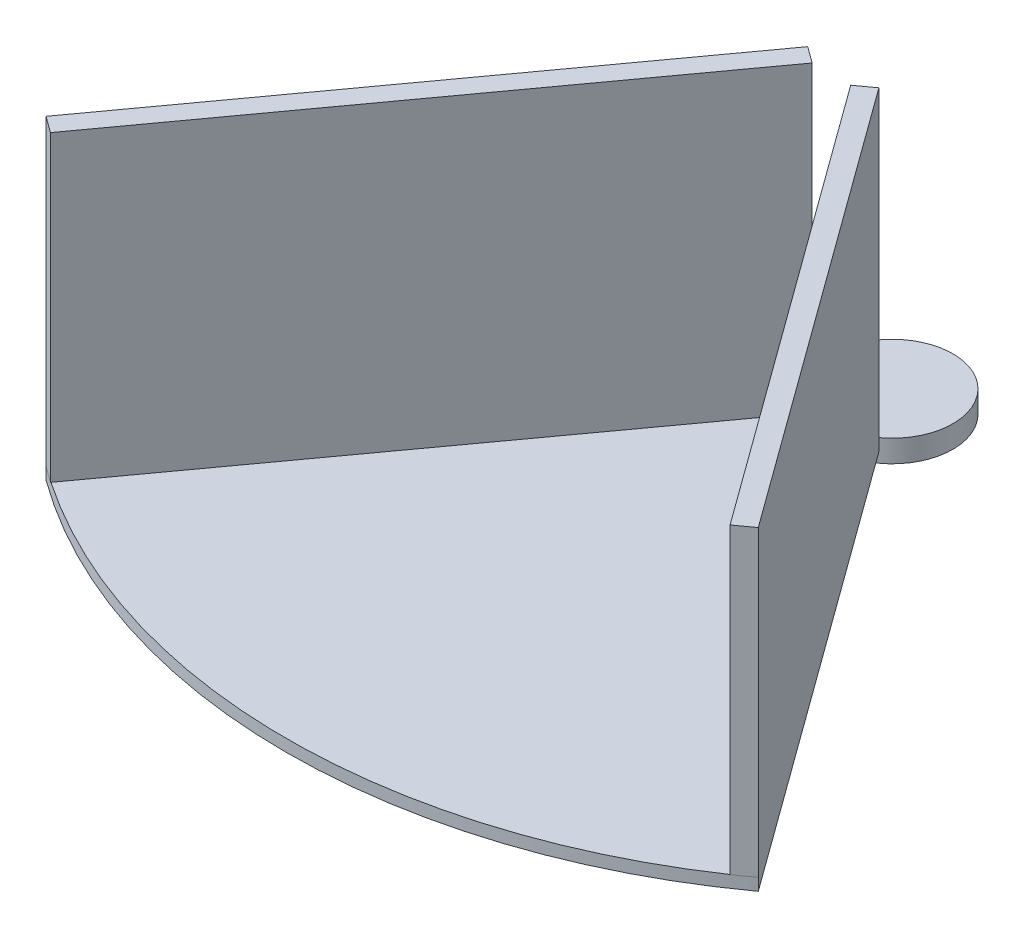
ISO-10303-21;
HEADER;
FILE_DESCRIPTION(('STEP AP214'),'2;1');
FILE_NAME('part.step','',(''),(''),'','','');
FILE_SCHEMA(('AUTOMOTIVE_DESIGN { 1 0 10303 214 1 1 1 1 }'));
ENDSEC;
DATA;
#1=APPLICATION_CONTEXT('core data for automotive mechanical design processes');
#2=APPLICATION_PROTOCOL_DEFINITION('international standard','automotive_design',2000,#1);
#3=PRODUCT_CONTEXT('',#1,'mechanical');
#4=PRODUCT('Part','Part','',(#3));
#5=PRODUCT_RELATED_PRODUCT_CATEGORY('part','',(#4));
#6=PRODUCT_DEFINITION_FORMATION('','',#4);
#7=PRODUCT_DEFINITION_CONTEXT('part definition',#1,'design');
#8=PRODUCT_DEFINITION('design','',#6,#7);
#9=PRODUCT_DEFINITION_SHAPE('','',#8);
#10=(LENGTH_UNIT() NAMED_UNIT(*) SI_UNIT(.MILLI.,.METRE.));
#11=(NAMED_UNIT(*) PLANE_ANGLE_UNIT() SI_UNIT($,.RADIAN.));
#12=(NAMED_UNIT(*) SI_UNIT($,.STERADIAN.) SOLID_ANGLE_UNIT());
#13=UNCERTAINTY_MEASURE_WITH_UNIT(LENGTH_MEASURE(1.E-05),#10,'distance_accuracy_value','');
#14=(GEOMETRIC_REPRESENTATION_CONTEXT(3) GLOBAL_UNCERTAINTY_ASSIGNED_CONTEXT((#13)) GLOBAL_UNIT_ASSIGNED_CONTEXT((#10,
#11,#12)) REPRESENTATION_CONTEXT('',''));
#15=CARTESIAN_POINT('',(0.,0.,0.));
#16=DIRECTION('',(0.,0.,1.));
#17=DIRECTION('',(1.,0.,0.));
#18=AXIS2_PLACEMENT_3D('',#15,#16,#17);
#19=CARTESIAN_POINT('',(0.,27.,0.));
#20=DIRECTION('',(0.,1.,0.));
#21=DIRECTION('',(0.,0.,1.));
#22=AXIS2_PLACEMENT_3D('',#19,#20,#21);
#23=PLANE('',#22);
#24=DIRECTION('',(0.587785252292468,0.,0.809016994374951));
#25=VECTOR('',#24,1.);
#26=CARTESIAN_POINT('',(9.54338762502458,27.,30.1483623541732));
#27=LINE('',#26,#25);
#28=CARTESIAN_POINT('',(9.54338762502457,27.,30.1483623541732));
#29=VERTEX_POINT('',#28);
#30=CARTESIAN_POINT('',(168.147414307867,27.,248.448077194368));
#31=VERTEX_POINT('',#30);
#32=EDGE_CURVE('E58',#29,#31,#27,.T.);
#33=ORIENTED_EDGE('',*,*,#32,.F.);
#34=DIRECTION('',(-0.809016994374951,0.,0.587785252292469));
#35=VECTOR('',#34,1.);
#36=CARTESIAN_POINT('',(17.6335575687741,27.,24.2705098312485));
#37=LINE('',#36,#35);
#38=CARTESIAN_POINT('',(17.6335575687741,27.,24.2705098312485));
#39=VERTEX_POINT('',#38);
#40=EDGE_CURVE('E152',#39,#29,#37,.T.);
#41=ORIENTED_EDGE('',*,*,#40,.F.);
#42=CARTESIAN_POINT('',(0.,27.,0.));
#43=DIRECTION('',(0.,1.,0.));
#44=DIRECTION('',(0.,0.,1.));
#45=AXIS2_PLACEMENT_3D('',#42,#43,#44);
#46=CIRCLE('',#45,30.);
#47=CARTESIAN_POINT('',(-17.6335575687744,27.,24.2705098312483));
#48=VERTEX_POINT('',#47);
#49=EDGE_CURVE('E200',#39,#48,#46,.T.);
#50=ORIENTED_EDGE('',*,*,#49,.T.);
#51=DIRECTION('',(-0.809016994374942,0.,-0.587785252292481));
#52=VECTOR('',#51,1.);
#53=CARTESIAN_POINT('',(-17.6335575687744,27.,24.2705098312483));
#54=LINE('',#53,#52);
#55=CARTESIAN_POINT('',(-9.54338762502495,27.,30.1483623541731));
#56=VERTEX_POINT('',#55);
#57=EDGE_CURVE('E169',#56,#48,#54,.T.);
#58=ORIENTED_EDGE('',*,*,#57,.F.);
#59=DIRECTION('',(0.587785252292481,0.,-0.809016994374942));
#60=VECTOR('',#59,1.);
#61=CARTESIAN_POINT('',(-168.245405743995,27.,248.582950835407));
#62=LINE('',#61,#60);
#63=CARTESIAN_POINT('',(-168.147414307871,27.,248.448077194365));
#64=VERTEX_POINT('',#63);
#65=EDGE_CURVE('E11',#64,#56,#62,.T.);
#66=ORIENTED_EDGE('',*,*,#65,.F.);
#67=CARTESIAN_POINT('',(0.,27.,0.));
#68=DIRECTION('',(0.,1.,0.));
#69=DIRECTION('',(0.,0.,1.));
#70=AXIS2_PLACEMENT_3D('',#67,#68,#69);
#71=CIRCLE('',#70,300.);
#72=EDGE_CURVE('E209',#64,#31,#71,.T.);
#73=ORIENTED_EDGE('',*,*,#72,.T.);
#74=EDGE_LOOP('',(#33,#41,#50,#58,#66,#73));
#75=FACE_BOUND('',#74,.T.);
#76=ADVANCED_FACE('F39',(#75),#23,.T.);
#77=CARTESIAN_POINT('',(0.,0.,0.));
#78=DIRECTION('',(0.,1.,0.));
#79=DIRECTION('',(0.,0.,1.));
#80=AXIS2_PLACEMENT_3D('',#77,#78,#79);
#81=PLANE('',#80);
#82=CARTESIAN_POINT('',(0.,0.,0.));
#83=DIRECTION('',(0.,1.,0.));
#84=DIRECTION('',(0.,0.,1.));
#85=AXIS2_PLACEMENT_3D('',#82,#83,#84);
#86=CIRCLE('',#85,6.);
#87=CARTESIAN_POINT('',(0.,0.,6.));
#88=VERTEX_POINT('',#87);
#89=EDGE_CURVE('E43',#88,#88,#86,.T.);
#90=ORIENTED_EDGE('',*,*,#89,.F.);
#91=EDGE_LOOP('',(#90));
#92=FACE_BOUND('',#91,.T.);
#93=CARTESIAN_POINT('',(0.,0.,0.));
#94=DIRECTION('',(0.,1.,0.));
#95=DIRECTION('',(0.,0.,1.));
#96=AXIS2_PLACEMENT_3D('',#93,#94,#95);
#97=CIRCLE('',#96,3.175);
#98=CARTESIAN_POINT('',(0.,0.,3.175));
#99=VERTEX_POINT('',#98);
#100=EDGE_CURVE('E244',#99,#99,#97,.T.);
#101=ORIENTED_EDGE('',*,*,#100,.T.);
#102=EDGE_LOOP('',(#101));
#103=FACE_BOUND('',#102,.T.);
#104=ADVANCED_FACE('F256',(#92,#103),#81,.F.);
#105=CARTESIAN_POINT('',(0.,16.,0.));
#106=DIRECTION('',(0.,-1.,0.));
#107=DIRECTION('',(0.,0.,-1.));
#108=AXIS2_PLACEMENT_3D('',#105,#106,#107);
#109=CYLINDRICAL_SURFACE('',#108,6.);
#110=CARTESIAN_POINT('',(0.,16.,0.));
#111=DIRECTION('',(0.,1.,0.));
#112=DIRECTION('',(0.,0.,1.));
#113=AXIS2_PLACEMENT_3D('',#110,#111,#112);
#114=CIRCLE('',#113,6.);
#115=CARTESIAN_POINT('',(0.,16.,6.));
#116=VERTEX_POINT('',#115);
#117=EDGE_CURVE('E49',#116,#116,#114,.T.);
#118=ORIENTED_EDGE('',*,*,#117,.F.);
#119=EDGE_LOOP('',(#118));
#120=FACE_BOUND('',#119,.T.);
#121=ORIENTED_EDGE('',*,*,#89,.T.);
#122=EDGE_LOOP('',(#121));
#123=FACE_BOUND('',#122,.T.);
#124=ADVANCED_FACE('F41',(#120,#123),#109,.T.);
#125=CARTESIAN_POINT('',(0.,16.,0.));
#126=DIRECTION('',(0.,-1.,0.));
#127=DIRECTION('',(0.,0.,-1.));
#128=AXIS2_PLACEMENT_3D('',#125,#126,#127);
#129=CYLINDRICAL_SURFACE('',#128,3.175);
#130=CARTESIAN_POINT('',(0.,16.,0.));
#131=DIRECTION('',(0.,1.,0.));
#132=DIRECTION('',(0.,0.,1.));
#133=AXIS2_PLACEMENT_3D('',#130,#131,#132);
#134=CIRCLE('',#133,3.175);
#135=CARTESIAN_POINT('',(0.,16.,3.175));
#136=VERTEX_POINT('',#135);
#137=EDGE_CURVE('E237',#136,#136,#134,.T.);
#138=ORIENTED_EDGE('',*,*,#137,.T.);
#139=EDGE_LOOP('',(#138));
#140=FACE_BOUND('',#139,.T.);
#141=ORIENTED_EDGE('',*,*,#100,.F.);
#142=EDGE_LOOP('',(#141));
#143=FACE_BOUND('',#142,.T.);
#144=ADVANCED_FACE('F261',(#140,#143),#129,.F.);
#145=CARTESIAN_POINT('',(0.,16.,0.));
#146=DIRECTION('',(0.,1.,0.));
#147=DIRECTION('',(0.,0.,1.));
#148=AXIS2_PLACEMENT_3D('',#145,#146,#147);
#149=PLANE('',#148);
#150=ORIENTED_EDGE('',*,*,#137,.F.);
#151=EDGE_LOOP('',(#150));
#152=FACE_BOUND('',#151,.T.);
#153=ADVANCED_FACE('F263',(#152),#149,.F.);
#154=CARTESIAN_POINT('',(0.,21.,0.));
#155=DIRECTION('',(0.,-1.,0.));
#156=DIRECTION('',(0.,0.,-1.));
#157=AXIS2_PLACEMENT_3D('',#154,#155,#156);
#158=CYLINDRICAL_SURFACE('',#157,30.);
#159=CARTESIAN_POINT('',(0.,21.,0.));
#160=DIRECTION('',(0.,1.,0.));
#161=DIRECTION('',(0.,0.,1.));
#162=AXIS2_PLACEMENT_3D('',#159,#160,#161);
#163=CIRCLE('',#162,30.);
#164=CARTESIAN_POINT('',(-17.6335575687744,21.,24.2705098312483));
#165=VERTEX_POINT('',#164);
#166=CARTESIAN_POINT('',(17.6335575687741,21.,24.2705098312485));
#167=VERTEX_POINT('',#166);
#168=EDGE_CURVE('E234',#165,#167,#163,.T.);
#169=ORIENTED_EDGE('',*,*,#168,.F.);
#170=DIRECTION('',(0.,-1.,0.));
#171=VECTOR('',#170,1.);
#172=CARTESIAN_POINT('',(-17.6335575687744,27.,24.2705098312483));
#173=LINE('',#172,#171);
#174=EDGE_CURVE('E229',#48,#165,#173,.T.);
#175=ORIENTED_EDGE('',*,*,#174,.F.);
#176=ORIENTED_EDGE('',*,*,#49,.F.);
#177=DIRECTION('',(0.,-1.,0.));
#178=VECTOR('',#177,1.);
#179=CARTESIAN_POINT('',(17.6335575687741,27.,24.2705098312485));
#180=LINE('',#179,#178);
#181=EDGE_CURVE('E208',#39,#167,#180,.T.);
#182=ORIENTED_EDGE('',*,*,#181,.T.);
#183=EDGE_LOOP('',(#169,#175,#176,#182));
#184=FACE_BOUND('',#183,.T.);
#185=CARTESIAN_POINT('',(0.,16.,0.));
#186=DIRECTION('',(0.,1.,0.));
#187=DIRECTION('',(0.,0.,1.));
#188=AXIS2_PLACEMENT_3D('',#185,#186,#187);
#189=CIRCLE('',#188,30.);
#190=CARTESIAN_POINT('',(0.,16.,30.));
#191=VERTEX_POINT('',#190);
#192=EDGE_CURVE('E233',#191,#191,#189,.T.);
#193=ORIENTED_EDGE('',*,*,#192,.T.);
#194=EDGE_LOOP('',(#193));
#195=FACE_BOUND('',#194,.T.);
#196=ADVANCED_FACE('F270',(#184,#195),#158,.T.);
#197=ORIENTED_EDGE('',*,*,#117,.T.);
#198=EDGE_LOOP('',(#197));
#199=FACE_BOUND('',#198,.T.);
#200=ORIENTED_EDGE('',*,*,#192,.F.);
#201=EDGE_LOOP('',(#200));
#202=FACE_BOUND('',#201,.T.);
#203=ADVANCED_FACE('F273',(#199,#202),#149,.F.);
#204=CARTESIAN_POINT('',(0.,21.,0.));
#205=DIRECTION('',(0.,1.,0.));
#206=DIRECTION('',(0.,0.,1.));
#207=AXIS2_PLACEMENT_3D('',#204,#205,#206);
#208=PLANE('',#207);
#209=DIRECTION('',(-0.58778525229248,0.,0.809016994374942));
#210=VECTOR('',#209,1.);
#211=CARTESIAN_POINT('',(-17.6335575687744,21.,24.2705098312483));
#212=LINE('',#211,#210);
#213=CARTESIAN_POINT('',(-176.335575687744,21.,242.705098312483));
#214=VERTEX_POINT('',#213);
#215=EDGE_CURVE('E199',#165,#214,#212,.T.);
#216=ORIENTED_EDGE('',*,*,#215,.F.);
#217=ORIENTED_EDGE('',*,*,#168,.T.);
#218=DIRECTION('',(-0.587785252292468,0.,-0.809016994374951));
#219=VECTOR('',#218,1.);
#220=CARTESIAN_POINT('',(17.6335575687741,21.,24.2705098312485));
#221=LINE('',#220,#219);
#222=CARTESIAN_POINT('',(176.335575687741,21.,242.705098312485));
#223=VERTEX_POINT('',#222);
#224=EDGE_CURVE('E203',#223,#167,#221,.T.);
#225=ORIENTED_EDGE('',*,*,#224,.F.);
#226=CARTESIAN_POINT('',(0.,21.,0.));
#227=DIRECTION('',(0.,1.,0.));
#228=DIRECTION('',(0.,0.,1.));
#229=AXIS2_PLACEMENT_3D('',#226,#227,#228);
#230=CIRCLE('',#229,300.);
#231=EDGE_CURVE('E212',#214,#223,#230,.T.);
#232=ORIENTED_EDGE('',*,*,#231,.F.);
#233=EDGE_LOOP('',(#216,#217,#225,#232));
#234=FACE_BOUND('',#233,.T.);
#235=ADVANCED_FACE('F286',(#234),#208,.F.);
#236=CARTESIAN_POINT('',(-17.6335575687744,27.,24.2705098312483));
#237=DIRECTION('',(0.809016994374942,0.,0.58778525229248));
#238=DIRECTION('',(0.58778525229248,0.,-0.809016994374942));
#239=AXIS2_PLACEMENT_3D('',#236,#237,#238);
#240=PLANE('',#239);
#241=ORIENTED_EDGE('',*,*,#215,.T.);
#242=DIRECTION('',(0.,-1.,0.));
#243=VECTOR('',#242,1.);
#244=CARTESIAN_POINT('',(-176.335575687744,27.,242.705098312483));
#245=LINE('',#244,#243);
#246=CARTESIAN_POINT('',(-176.335575687744,27.,242.705098312483));
#247=VERTEX_POINT('',#246);
#248=EDGE_CURVE('E225',#247,#214,#245,.T.);
#249=ORIENTED_EDGE('',*,*,#248,.F.);
#250=DIRECTION('',(0.,-1.,0.));
#251=VECTOR('',#250,1.);
#252=CARTESIAN_POINT('',(-176.335575687744,177.,242.705098312483));
#253=LINE('',#252,#251);
#254=CARTESIAN_POINT('',(-176.335575687744,177.,242.705098312483));
#255=VERTEX_POINT('',#254);
#256=EDGE_CURVE('E177',#255,#247,#253,.T.);
#257=ORIENTED_EDGE('',*,*,#256,.F.);
#258=DIRECTION('',(-0.58778525229248,0.,0.809016994374942));
#259=VECTOR('',#258,1.);
#260=CARTESIAN_POINT('',(-176.335575687744,177.,242.705098312483));
#261=LINE('',#260,#259);
#262=CARTESIAN_POINT('',(-17.6335575687744,177.,24.2705098312483));
#263=VERTEX_POINT('',#262);
#264=EDGE_CURVE('E175',#263,#255,#261,.T.);
#265=ORIENTED_EDGE('',*,*,#264,.F.);
#266=DIRECTION('',(0.,-1.,0.));
#267=VECTOR('',#266,1.);
#268=CARTESIAN_POINT('',(-17.6335575687744,177.,24.2705098312483));
#269=LINE('',#268,#267);
#270=EDGE_CURVE('E187',#263,#48,#269,.T.);
#271=ORIENTED_EDGE('',*,*,#270,.T.);
#272=ORIENTED_EDGE('',*,*,#174,.T.);
#273=EDGE_LOOP('',(#241,#249,#257,#265,#271,#272));
#274=FACE_BOUND('',#273,.T.);
#275=ADVANCED_FACE('F289',(#274),#240,.F.);
#276=CARTESIAN_POINT('',(0.,27.,0.));
#277=DIRECTION('',(0.,-1.,0.));
#278=DIRECTION('',(0.,0.,-1.));
#279=AXIS2_PLACEMENT_3D('',#276,#277,#278);
#280=CYLINDRICAL_SURFACE('',#279,300.);
#281=ORIENTED_EDGE('',*,*,#231,.T.);
#282=DIRECTION('',(0.,-1.,0.));
#283=VECTOR('',#282,1.);
#284=CARTESIAN_POINT('',(176.335575687741,27.,242.705098312485));
#285=LINE('',#284,#283);
#286=CARTESIAN_POINT('',(176.335575687741,27.,242.705098312485));
#287=VERTEX_POINT('',#286);
#288=EDGE_CURVE('E221',#287,#223,#285,.T.);
#289=ORIENTED_EDGE('',*,*,#288,.F.);
#290=EDGE_CURVE('E66',#31,#287,#71,.T.);
#291=ORIENTED_EDGE('',*,*,#290,.F.);
#292=ORIENTED_EDGE('',*,*,#72,.F.);
#293=EDGE_CURVE('E204',#247,#64,#71,.T.);
#294=ORIENTED_EDGE('',*,*,#293,.F.);
#295=ORIENTED_EDGE('',*,*,#248,.T.);
#296=EDGE_LOOP('',(#281,#289,#291,#292,#294,#295));
#297=FACE_BOUND('',#296,.T.);
#298=ADVANCED_FACE('F295',(#297),#280,.T.);
#299=CARTESIAN_POINT('',(17.6335575687741,27.,24.2705098312485));
#300=DIRECTION('',(-0.809016994374951,0.,0.587785252292468));
#301=DIRECTION('',(0.587785252292468,0.,0.809016994374951));
#302=AXIS2_PLACEMENT_3D('',#299,#300,#301);
#303=PLANE('',#302);
#304=ORIENTED_EDGE('',*,*,#224,.T.);
#305=ORIENTED_EDGE('',*,*,#181,.F.);
#306=DIRECTION('',(0.,-1.,0.));
#307=VECTOR('',#306,1.);
#308=CARTESIAN_POINT('',(17.6335575687741,177.,24.2705098312485));
#309=LINE('',#308,#307);
#310=CARTESIAN_POINT('',(17.6335575687741,177.,24.2705098312485));
#311=VERTEX_POINT('',#310);
#312=EDGE_CURVE('E487',#311,#39,#309,.T.);
#313=ORIENTED_EDGE('',*,*,#312,.F.);
#314=DIRECTION('',(-0.587785252292468,0.,-0.809016994374951));
#315=VECTOR('',#314,1.);
#316=CARTESIAN_POINT('',(17.6335575687741,177.,24.2705098312485));
#317=LINE('',#316,#315);
#318=CARTESIAN_POINT('',(176.335575687741,177.,242.705098312485));
#319=VERTEX_POINT('',#318);
#320=EDGE_CURVE('E144',#319,#311,#317,.T.);
#321=ORIENTED_EDGE('',*,*,#320,.F.);
#322=DIRECTION('',(0.,-1.,0.));
#323=VECTOR('',#322,1.);
#324=CARTESIAN_POINT('',(176.335575687741,177.,242.705098312485));
#325=LINE('',#324,#323);
#326=EDGE_CURVE('E160',#319,#287,#325,.T.);
#327=ORIENTED_EDGE('',*,*,#326,.T.);
#328=ORIENTED_EDGE('',*,*,#288,.T.);
#329=EDGE_LOOP('',(#304,#305,#313,#321,#327,#328));
#330=FACE_BOUND('',#329,.T.);
#331=ADVANCED_FACE('F291',(#330),#303,.F.);
#332=CARTESIAN_POINT('',(0.,27.,0.));
#333=DIRECTION('',(0.,1.,0.));
#334=DIRECTION('',(0.,0.,1.));
#335=AXIS2_PLACEMENT_3D('',#332,#333,#334);
#336=PLANE('',#335);
#337=DIRECTION('',(0.809016994374942,0.,0.58778525229248));
#338=VECTOR('',#337,1.);
#339=CARTESIAN_POINT('',(-176.335575687744,27.,242.705098312483));
#340=LINE('',#339,#338);
#341=CARTESIAN_POINT('',(-168.245405743995,27.,248.582950835407));
#342=VERTEX_POINT('',#341);
#343=EDGE_CURVE('E154',#247,#342,#340,.T.);
#344=ORIENTED_EDGE('',*,*,#343,.F.);
#345=ORIENTED_EDGE('',*,*,#293,.T.);
#346=EDGE_CURVE('E51',#342,#64,#62,.T.);
#347=ORIENTED_EDGE('',*,*,#346,.F.);
#348=EDGE_LOOP('',(#344,#345,#347));
#349=FACE_BOUND('',#348,.T.);
#350=ADVANCED_FACE('F294',(#349),#336,.F.);
#351=CARTESIAN_POINT('',(-176.335575687744,177.,242.705098312483));
#352=DIRECTION('',(0.58778525229248,0.,-0.809016994374942));
#353=DIRECTION('',(-0.809016994374942,0.,-0.58778525229248));
#354=AXIS2_PLACEMENT_3D('',#351,#352,#353);
#355=PLANE('',#354);
#356=ORIENTED_EDGE('',*,*,#343,.T.);
#357=DIRECTION('',(0.,-1.,0.));
#358=VECTOR('',#357,1.);
#359=CARTESIAN_POINT('',(-168.245405743995,177.,248.582950835407));
#360=LINE('',#359,#358);
#361=CARTESIAN_POINT('',(-168.245405743995,177.,248.582950835407));
#362=VERTEX_POINT('',#361);
#363=EDGE_CURVE('E195',#362,#342,#360,.T.);
#364=ORIENTED_EDGE('',*,*,#363,.F.);
#365=DIRECTION('',(0.809016994374942,0.,0.58778525229248));
#366=VECTOR('',#365,1.);
#367=CARTESIAN_POINT('',(-176.335575687744,177.,242.705098312483));
#368=LINE('',#367,#366);
#369=EDGE_CURVE('E164',#255,#362,#368,.T.);
#370=ORIENTED_EDGE('',*,*,#369,.F.);
#371=ORIENTED_EDGE('',*,*,#256,.T.);
#372=EDGE_LOOP('',(#356,#364,#370,#371));
#373=FACE_BOUND('',#372,.T.);
#374=ADVANCED_FACE('F284',(#373),#355,.F.);
#375=CARTESIAN_POINT('',(-168.245405743995,177.,248.582950835407));
#376=DIRECTION('',(-0.809016994374942,0.,-0.587785252292481));
#377=DIRECTION('',(-0.587785252292481,0.,0.809016994374942));
#378=AXIS2_PLACEMENT_3D('',#375,#376,#377);
#379=PLANE('',#378);
#380=ORIENTED_EDGE('',*,*,#346,.T.);
#381=ORIENTED_EDGE('',*,*,#65,.T.);
#382=DIRECTION('',(0.,-1.,0.));
#383=VECTOR('',#382,1.);
#384=CARTESIAN_POINT('',(-9.54338762502495,177.,30.1483623541731));
#385=LINE('',#384,#383);
#386=CARTESIAN_POINT('',(-9.54338762502495,177.,30.1483623541731));
#387=VERTEX_POINT('',#386);
#388=EDGE_CURVE('E191',#387,#56,#385,.T.);
#389=ORIENTED_EDGE('',*,*,#388,.F.);
#390=DIRECTION('',(0.587785252292481,0.,-0.809016994374942));
#391=VECTOR('',#390,1.);
#392=CARTESIAN_POINT('',(-168.245405743995,177.,248.582950835407));
#393=LINE('',#392,#391);
#394=EDGE_CURVE('E168',#362,#387,#393,.T.);
#395=ORIENTED_EDGE('',*,*,#394,.F.);
#396=ORIENTED_EDGE('',*,*,#363,.T.);
#397=EDGE_LOOP('',(#380,#381,#389,#395,#396));
#398=FACE_BOUND('',#397,.T.);
#399=ADVANCED_FACE('F322',(#398),#379,.F.);
#400=CARTESIAN_POINT('',(-17.6335575687744,177.,24.2705098312483));
#401=DIRECTION('',(-0.587785252292481,0.,0.809016994374942));
#402=DIRECTION('',(0.809016994374942,0.,0.587785252292481));
#403=AXIS2_PLACEMENT_3D('',#400,#401,#402);
#404=PLANE('',#403);
#405=ORIENTED_EDGE('',*,*,#57,.T.);
#406=ORIENTED_EDGE('',*,*,#270,.F.);
#407=DIRECTION('',(-0.809016994374942,0.,-0.587785252292481));
#408=VECTOR('',#407,1.);
#409=CARTESIAN_POINT('',(-17.6335575687744,177.,24.2705098312483));
#410=LINE('',#409,#408);
#411=EDGE_CURVE('E172',#387,#263,#410,.T.);
#412=ORIENTED_EDGE('',*,*,#411,.F.);
#413=ORIENTED_EDGE('',*,*,#388,.T.);
#414=EDGE_LOOP('',(#405,#406,#412,#413));
#415=FACE_BOUND('',#414,.T.);
#416=ADVANCED_FACE('F319',(#415),#404,.F.);
#417=CARTESIAN_POINT('',(0.,177.,0.));
#418=DIRECTION('',(0.,1.,0.));
#419=DIRECTION('',(0.,0.,1.));
#420=AXIS2_PLACEMENT_3D('',#417,#418,#419);
#421=PLANE('',#420);
#422=ORIENTED_EDGE('',*,*,#369,.T.);
#423=ORIENTED_EDGE('',*,*,#394,.T.);
#424=ORIENTED_EDGE('',*,*,#411,.T.);
#425=ORIENTED_EDGE('',*,*,#264,.T.);
#426=EDGE_LOOP('',(#422,#423,#424,#425));
#427=FACE_BOUND('',#426,.T.);
#428=ADVANCED_FACE('F330',(#427),#421,.T.);
#429=CARTESIAN_POINT('',(0.,27.,0.));
#430=DIRECTION('',(0.,1.,0.));
#431=DIRECTION('',(0.,0.,1.));
#432=AXIS2_PLACEMENT_3D('',#429,#430,#431);
#433=PLANE('',#432);
#434=CARTESIAN_POINT('',(168.245405743991,27.,248.58295083541));
#435=VERTEX_POINT('',#434);
#436=EDGE_CURVE('E493',#31,#435,#27,.T.);
#437=ORIENTED_EDGE('',*,*,#436,.F.);
#438=ORIENTED_EDGE('',*,*,#290,.T.);
#439=DIRECTION('',(0.80901699437495,0.,-0.587785252292469));
#440=VECTOR('',#439,1.);
#441=CARTESIAN_POINT('',(176.335575687741,27.,242.705098312485));
#442=LINE('',#441,#440);
#443=EDGE_CURVE('E149',#435,#287,#442,.T.);
#444=ORIENTED_EDGE('',*,*,#443,.F.);
#445=EDGE_LOOP('',(#437,#438,#444));
#446=FACE_BOUND('',#445,.T.);
#447=ADVANCED_FACE('F332',(#446),#433,.F.);
#448=CARTESIAN_POINT('',(17.6335575687741,177.,24.2705098312485));
#449=DIRECTION('',(0.587785252292469,0.,0.809016994374951));
#450=DIRECTION('',(0.809016994374951,0.,-0.587785252292469));
#451=AXIS2_PLACEMENT_3D('',#448,#449,#450);
#452=PLANE('',#451);
#453=ORIENTED_EDGE('',*,*,#40,.T.);
#454=DIRECTION('',(0.,-1.,0.));
#455=VECTOR('',#454,1.);
#456=CARTESIAN_POINT('',(9.54338762502458,177.,30.1483623541732));
#457=LINE('',#456,#455);
#458=CARTESIAN_POINT('',(9.54338762502458,177.,30.1483623541732));
#459=VERTEX_POINT('',#458);
#460=EDGE_CURVE('E131',#459,#29,#457,.T.);
#461=ORIENTED_EDGE('',*,*,#460,.F.);
#462=DIRECTION('',(-0.809016994374951,0.,0.587785252292469));
#463=VECTOR('',#462,1.);
#464=CARTESIAN_POINT('',(17.6335575687741,177.,24.2705098312485));
#465=LINE('',#464,#463);
#466=EDGE_CURVE('E139',#311,#459,#465,.T.);
#467=ORIENTED_EDGE('',*,*,#466,.F.);
#468=ORIENTED_EDGE('',*,*,#312,.T.);
#469=EDGE_LOOP('',(#453,#461,#467,#468));
#470=FACE_BOUND('',#469,.T.);
#471=ADVANCED_FACE('F151',(#470),#452,.F.);
#472=CARTESIAN_POINT('',(9.54338762502458,177.,30.1483623541732));
#473=DIRECTION('',(0.809016994374951,0.,-0.587785252292468));
#474=DIRECTION('',(-0.587785252292468,0.,-0.809016994374951));
#475=AXIS2_PLACEMENT_3D('',#472,#473,#474);
#476=PLANE('',#475);
#477=ORIENTED_EDGE('',*,*,#32,.T.);
#478=ORIENTED_EDGE('',*,*,#436,.T.);
#479=DIRECTION('',(0.,-1.,0.));
#480=VECTOR('',#479,1.);
#481=CARTESIAN_POINT('',(168.245405743991,177.,248.58295083541));
#482=LINE('',#481,#480);
#483=CARTESIAN_POINT('',(168.245405743991,177.,248.58295083541));
#484=VERTEX_POINT('',#483);
#485=EDGE_CURVE('E134',#484,#435,#482,.T.);
#486=ORIENTED_EDGE('',*,*,#485,.F.);
#487=DIRECTION('',(0.587785252292468,0.,0.809016994374951));
#488=VECTOR('',#487,1.);
#489=CARTESIAN_POINT('',(9.54338762502458,177.,30.1483623541732));
#490=LINE('',#489,#488);
#491=EDGE_CURVE('E127',#459,#484,#490,.T.);
#492=ORIENTED_EDGE('',*,*,#491,.F.);
#493=ORIENTED_EDGE('',*,*,#460,.T.);
#494=EDGE_LOOP('',(#477,#478,#486,#492,#493));
#495=FACE_BOUND('',#494,.T.);
#496=ADVANCED_FACE('F129',(#495),#476,.F.);
#497=CARTESIAN_POINT('',(176.335575687741,177.,242.705098312485));
#498=DIRECTION('',(-0.587785252292469,0.,-0.80901699437495));
#499=DIRECTION('',(-0.80901699437495,0.,0.587785252292469));
#500=AXIS2_PLACEMENT_3D('',#497,#498,#499);
#501=PLANE('',#500);
#502=ORIENTED_EDGE('',*,*,#443,.T.);
#503=ORIENTED_EDGE('',*,*,#326,.F.);
#504=DIRECTION('',(0.80901699437495,0.,-0.587785252292469));
#505=VECTOR('',#504,1.);
#506=CARTESIAN_POINT('',(176.335575687741,177.,242.705098312485));
#507=LINE('',#506,#505);
#508=EDGE_CURVE('E138',#484,#319,#507,.T.);
#509=ORIENTED_EDGE('',*,*,#508,.F.);
#510=ORIENTED_EDGE('',*,*,#485,.T.);
#511=EDGE_LOOP('',(#502,#503,#509,#510));
#512=FACE_BOUND('',#511,.T.);
#513=ADVANCED_FACE('F458',(#512),#501,.F.);
#514=CARTESIAN_POINT('',(0.,177.,0.));
#515=DIRECTION('',(0.,1.,0.));
#516=DIRECTION('',(0.,0.,1.));
#517=AXIS2_PLACEMENT_3D('',#514,#515,#516);
#518=PLANE('',#517);
#519=ORIENTED_EDGE('',*,*,#466,.T.);
#520=ORIENTED_EDGE('',*,*,#491,.T.);
#521=ORIENTED_EDGE('',*,*,#508,.T.);
#522=ORIENTED_EDGE('',*,*,#320,.T.);
#523=EDGE_LOOP('',(#519,#520,#521,#522));
#524=FACE_BOUND('',#523,.T.);
#525=ADVANCED_FACE('F142',(#524),#518,.T.);
#526=CLOSED_SHELL('',(#76,#104,#124,#144,#153,#196,#203,#235,#275,#298,#331,#350,#374,#399,#416,
#428,#447,#471,#496,#513,#525));
#527=MANIFOLD_SOLID_BREP('B2',#526);
#528=ADVANCED_BREP_SHAPE_REPRESENTATION('',(#18,#527),#14);
#529=SHAPE_DEFINITION_REPRESENTATION(#9,#528);
ENDSEC;
END-ISO-10303-21;
